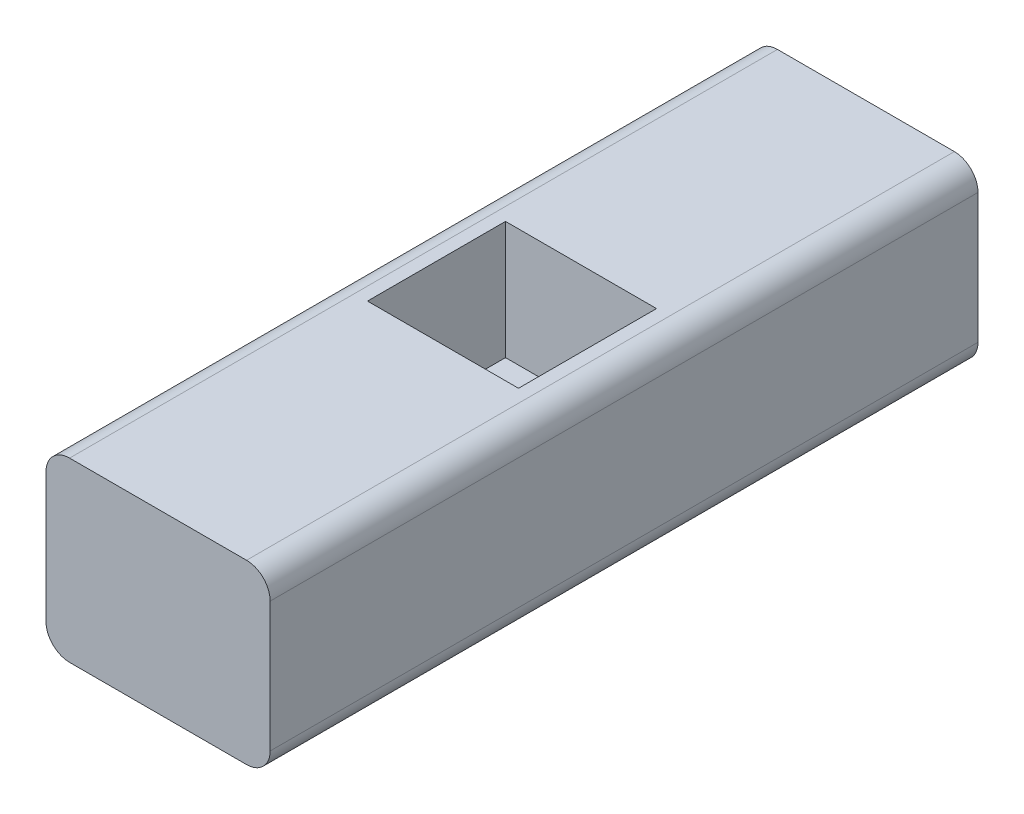
ISO-10303-21;
HEADER;
FILE_DESCRIPTION(('STEP AP214'),'2;1');
FILE_NAME('part.step','',(''),(''),'','','');
FILE_SCHEMA(('AUTOMOTIVE_DESIGN { 1 0 10303 214 1 1 1 1 }'));
ENDSEC;
DATA;
#1=APPLICATION_CONTEXT('core data for automotive mechanical design processes');
#2=APPLICATION_PROTOCOL_DEFINITION('international standard','automotive_design',2000,#1);
#3=PRODUCT_CONTEXT('',#1,'mechanical');
#4=PRODUCT('Part','Part','',(#3));
#5=PRODUCT_RELATED_PRODUCT_CATEGORY('part','',(#4));
#6=PRODUCT_DEFINITION_FORMATION('','',#4);
#7=PRODUCT_DEFINITION_CONTEXT('part definition',#1,'design');
#8=PRODUCT_DEFINITION('design','',#6,#7);
#9=PRODUCT_DEFINITION_SHAPE('','',#8);
#10=(LENGTH_UNIT() NAMED_UNIT(*) SI_UNIT(.MILLI.,.METRE.));
#11=(NAMED_UNIT(*) PLANE_ANGLE_UNIT() SI_UNIT($,.RADIAN.));
#12=(NAMED_UNIT(*) SI_UNIT($,.STERADIAN.) SOLID_ANGLE_UNIT());
#13=UNCERTAINTY_MEASURE_WITH_UNIT(LENGTH_MEASURE(1.E-05),#10,'distance_accuracy_value','');
#14=(GEOMETRIC_REPRESENTATION_CONTEXT(3) GLOBAL_UNCERTAINTY_ASSIGNED_CONTEXT((#13)) GLOBAL_UNIT_ASSIGNED_CONTEXT((#10,
#11,#12)) REPRESENTATION_CONTEXT('',''));
#15=CARTESIAN_POINT('',(0.,0.,0.));
#16=DIRECTION('',(0.,0.,1.));
#17=DIRECTION('',(1.,0.,0.));
#18=AXIS2_PLACEMENT_3D('',#15,#16,#17);
#19=CARTESIAN_POINT('',(15.,-11.,120.));
#20=DIRECTION('',(0.,0.,-1.));
#21=DIRECTION('',(-1.,0.,0.));
#22=AXIS2_PLACEMENT_3D('',#19,#20,#21);
#23=CYLINDRICAL_SURFACE('',#22,4.);
#24=CARTESIAN_POINT('',(15.,-11.,0.));
#25=DIRECTION('',(0.,0.,1.));
#26=DIRECTION('',(1.,0.,0.));
#27=AXIS2_PLACEMENT_3D('',#24,#25,#26);
#28=CIRCLE('',#27,4.);
#29=CARTESIAN_POINT('',(15.,-15.,0.));
#30=VERTEX_POINT('',#29);
#31=CARTESIAN_POINT('',(19.,-11.,0.));
#32=VERTEX_POINT('',#31);
#33=EDGE_CURVE('E147',#30,#32,#28,.T.);
#34=ORIENTED_EDGE('',*,*,#33,.T.);
#35=DIRECTION('',(0.,0.,-1.));
#36=VECTOR('',#35,1.);
#37=CARTESIAN_POINT('',(19.,-11.,120.));
#38=LINE('',#37,#36);
#39=CARTESIAN_POINT('',(19.,-11.,120.));
#40=VERTEX_POINT('',#39);
#41=EDGE_CURVE('E176',#40,#32,#38,.T.);
#42=ORIENTED_EDGE('',*,*,#41,.F.);
#43=CARTESIAN_POINT('',(15.,-11.,120.));
#44=DIRECTION('',(0.,0.,1.));
#45=DIRECTION('',(1.,0.,0.));
#46=AXIS2_PLACEMENT_3D('',#43,#44,#45);
#47=CIRCLE('',#46,4.);
#48=CARTESIAN_POINT('',(15.,-15.,120.));
#49=VERTEX_POINT('',#48);
#50=EDGE_CURVE('E163',#49,#40,#47,.T.);
#51=ORIENTED_EDGE('',*,*,#50,.F.);
#52=DIRECTION('',(0.,0.,-1.));
#53=VECTOR('',#52,1.);
#54=CARTESIAN_POINT('',(15.,-15.,120.));
#55=LINE('',#54,#53);
#56=EDGE_CURVE('E143',#49,#30,#55,.T.);
#57=ORIENTED_EDGE('',*,*,#56,.T.);
#58=EDGE_LOOP('',(#34,#42,#51,#57));
#59=FACE_BOUND('',#58,.T.);
#60=ADVANCED_FACE('F39',(#59),#23,.T.);
#61=CARTESIAN_POINT('',(19.,-11.,120.));
#62=DIRECTION('',(-1.,0.,0.));
#63=DIRECTION('',(0.,0.,1.));
#64=AXIS2_PLACEMENT_3D('',#61,#62,#63);
#65=PLANE('',#64);
#66=DIRECTION('',(0.,1.,0.));
#67=VECTOR('',#66,1.);
#68=CARTESIAN_POINT('',(19.,-11.,0.));
#69=LINE('',#68,#67);
#70=CARTESIAN_POINT('',(19.,11.,0.));
#71=VERTEX_POINT('',#70);
#72=EDGE_CURVE('E150',#32,#71,#69,.T.);
#73=ORIENTED_EDGE('',*,*,#72,.T.);
#74=DIRECTION('',(0.,0.,-1.));
#75=VECTOR('',#74,1.);
#76=CARTESIAN_POINT('',(19.,11.,120.));
#77=LINE('',#76,#75);
#78=CARTESIAN_POINT('',(19.,11.,120.));
#79=VERTEX_POINT('',#78);
#80=EDGE_CURVE('E173',#79,#71,#77,.T.);
#81=ORIENTED_EDGE('',*,*,#80,.F.);
#82=DIRECTION('',(0.,1.,0.));
#83=VECTOR('',#82,1.);
#84=CARTESIAN_POINT('',(19.,-11.,120.));
#85=LINE('',#84,#83);
#86=EDGE_CURVE('E104',#40,#79,#85,.T.);
#87=ORIENTED_EDGE('',*,*,#86,.F.);
#88=ORIENTED_EDGE('',*,*,#41,.T.);
#89=EDGE_LOOP('',(#73,#81,#87,#88));
#90=FACE_BOUND('',#89,.T.);
#91=ADVANCED_FACE('F243',(#90),#65,.F.);
#92=CARTESIAN_POINT('',(15.,11.,120.));
#93=DIRECTION('',(0.,0.,-1.));
#94=DIRECTION('',(-1.,0.,0.));
#95=AXIS2_PLACEMENT_3D('',#92,#93,#94);
#96=CYLINDRICAL_SURFACE('',#95,4.);
#97=CARTESIAN_POINT('',(15.,11.,0.));
#98=DIRECTION('',(0.,0.,1.));
#99=DIRECTION('',(-1.,0.,0.));
#100=AXIS2_PLACEMENT_3D('',#97,#98,#99);
#101=CIRCLE('',#100,4.);
#102=CARTESIAN_POINT('',(15.,15.,0.));
#103=VERTEX_POINT('',#102);
#104=EDGE_CURVE('E153',#71,#103,#101,.T.);
#105=ORIENTED_EDGE('',*,*,#104,.T.);
#106=DIRECTION('',(0.,0.,-1.));
#107=VECTOR('',#106,1.);
#108=CARTESIAN_POINT('',(15.,15.,120.));
#109=LINE('',#108,#107);
#110=CARTESIAN_POINT('',(15.,15.,120.));
#111=VERTEX_POINT('',#110);
#112=EDGE_CURVE('E170',#111,#103,#109,.T.);
#113=ORIENTED_EDGE('',*,*,#112,.F.);
#114=CARTESIAN_POINT('',(15.,11.,120.));
#115=DIRECTION('',(0.,0.,1.));
#116=DIRECTION('',(-1.,0.,0.));
#117=AXIS2_PLACEMENT_3D('',#114,#115,#116);
#118=CIRCLE('',#117,4.);
#119=EDGE_CURVE('E225',#79,#111,#118,.T.);
#120=ORIENTED_EDGE('',*,*,#119,.F.);
#121=ORIENTED_EDGE('',*,*,#80,.T.);
#122=EDGE_LOOP('',(#105,#113,#120,#121));
#123=FACE_BOUND('',#122,.T.);
#124=ADVANCED_FACE('F246',(#123),#96,.T.);
#125=CARTESIAN_POINT('',(-15.,15.,120.));
#126=DIRECTION('',(0.,-1.,0.));
#127=DIRECTION('',(0.,0.,-1.));
#128=AXIS2_PLACEMENT_3D('',#125,#126,#127);
#129=PLANE('',#128);
#130=DIRECTION('',(-1.,0.,0.));
#131=VECTOR('',#130,1.);
#132=CARTESIAN_POINT('',(-15.,15.,48.3));
#133=LINE('',#132,#131);
#134=CARTESIAN_POINT('',(12.8,15.,48.3));
#135=VERTEX_POINT('',#134);
#136=CARTESIAN_POINT('',(-12.8,15.,48.3));
#137=VERTEX_POINT('',#136);
#138=EDGE_CURVE('E180',#135,#137,#133,.T.);
#139=ORIENTED_EDGE('',*,*,#138,.F.);
#140=DIRECTION('',(0.,0.,1.));
#141=VECTOR('',#140,1.);
#142=CARTESIAN_POINT('',(12.8,15.,120.));
#143=LINE('',#142,#141);
#144=CARTESIAN_POINT('',(12.8,15.,71.7));
#145=VERTEX_POINT('',#144);
#146=EDGE_CURVE('E11',#135,#145,#143,.T.);
#147=ORIENTED_EDGE('',*,*,#146,.T.);
#148=DIRECTION('',(1.,0.,0.));
#149=VECTOR('',#148,1.);
#150=CARTESIAN_POINT('',(-15.,15.,71.7));
#151=LINE('',#150,#149);
#152=CARTESIAN_POINT('',(-12.8,15.,71.7));
#153=VERTEX_POINT('',#152);
#154=EDGE_CURVE('E46',#153,#145,#151,.T.);
#155=ORIENTED_EDGE('',*,*,#154,.F.);
#156=DIRECTION('',(0.,0.,1.));
#157=VECTOR('',#156,1.);
#158=CARTESIAN_POINT('',(-12.8,15.,120.));
#159=LINE('',#158,#157);
#160=EDGE_CURVE('E178',#137,#153,#159,.T.);
#161=ORIENTED_EDGE('',*,*,#160,.F.);
#162=EDGE_LOOP('',(#139,#147,#155,#161));
#163=FACE_BOUND('',#162,.T.);
#164=DIRECTION('',(-1.,0.,0.));
#165=VECTOR('',#164,1.);
#166=CARTESIAN_POINT('',(-15.,15.,0.));
#167=LINE('',#166,#165);
#168=CARTESIAN_POINT('',(-15.,15.,0.));
#169=VERTEX_POINT('',#168);
#170=EDGE_CURVE('E155',#103,#169,#167,.T.);
#171=ORIENTED_EDGE('',*,*,#170,.T.);
#172=DIRECTION('',(0.,0.,-1.));
#173=VECTOR('',#172,1.);
#174=CARTESIAN_POINT('',(-15.,15.,120.));
#175=LINE('',#174,#173);
#176=CARTESIAN_POINT('',(-15.,15.,120.));
#177=VERTEX_POINT('',#176);
#178=EDGE_CURVE('E167',#177,#169,#175,.T.);
#179=ORIENTED_EDGE('',*,*,#178,.F.);
#180=DIRECTION('',(-1.,0.,0.));
#181=VECTOR('',#180,1.);
#182=CARTESIAN_POINT('',(-15.,15.,120.));
#183=LINE('',#182,#181);
#184=EDGE_CURVE('E227',#111,#177,#183,.T.);
#185=ORIENTED_EDGE('',*,*,#184,.F.);
#186=ORIENTED_EDGE('',*,*,#112,.T.);
#187=EDGE_LOOP('',(#171,#179,#185,#186));
#188=FACE_BOUND('',#187,.T.);
#189=ADVANCED_FACE('F208',(#163,#188),#129,.F.);
#190=CARTESIAN_POINT('',(-15.,11.,120.));
#191=DIRECTION('',(0.,0.,-1.));
#192=DIRECTION('',(-1.,0.,0.));
#193=AXIS2_PLACEMENT_3D('',#190,#191,#192);
#194=CYLINDRICAL_SURFACE('',#193,4.);
#195=CARTESIAN_POINT('',(-15.,11.,0.));
#196=DIRECTION('',(0.,0.,1.));
#197=DIRECTION('',(-1.,0.,0.));
#198=AXIS2_PLACEMENT_3D('',#195,#196,#197);
#199=CIRCLE('',#198,4.);
#200=CARTESIAN_POINT('',(-19.,11.,0.));
#201=VERTEX_POINT('',#200);
#202=EDGE_CURVE('E157',#169,#201,#199,.T.);
#203=ORIENTED_EDGE('',*,*,#202,.T.);
#204=DIRECTION('',(0.,0.,-1.));
#205=VECTOR('',#204,1.);
#206=CARTESIAN_POINT('',(-19.,11.,120.));
#207=LINE('',#206,#205);
#208=CARTESIAN_POINT('',(-19.,11.,120.));
#209=VERTEX_POINT('',#208);
#210=EDGE_CURVE('E138',#209,#201,#207,.T.);
#211=ORIENTED_EDGE('',*,*,#210,.F.);
#212=CARTESIAN_POINT('',(-15.,11.,120.));
#213=DIRECTION('',(0.,0.,1.));
#214=DIRECTION('',(-1.,0.,0.));
#215=AXIS2_PLACEMENT_3D('',#212,#213,#214);
#216=CIRCLE('',#215,4.);
#217=EDGE_CURVE('E126',#177,#209,#216,.T.);
#218=ORIENTED_EDGE('',*,*,#217,.F.);
#219=ORIENTED_EDGE('',*,*,#178,.T.);
#220=EDGE_LOOP('',(#203,#211,#218,#219));
#221=FACE_BOUND('',#220,.T.);
#222=ADVANCED_FACE('F235',(#221),#194,.T.);
#223=CARTESIAN_POINT('',(-19.,-11.,120.));
#224=DIRECTION('',(1.,0.,0.));
#225=DIRECTION('',(0.,0.,-1.));
#226=AXIS2_PLACEMENT_3D('',#223,#224,#225);
#227=PLANE('',#226);
#228=DIRECTION('',(0.,-1.,0.));
#229=VECTOR('',#228,1.);
#230=CARTESIAN_POINT('',(-19.,-11.,0.));
#231=LINE('',#230,#229);
#232=CARTESIAN_POINT('',(-19.,-11.,0.));
#233=VERTEX_POINT('',#232);
#234=EDGE_CURVE('E135',#201,#233,#231,.T.);
#235=ORIENTED_EDGE('',*,*,#234,.T.);
#236=DIRECTION('',(0.,0.,-1.));
#237=VECTOR('',#236,1.);
#238=CARTESIAN_POINT('',(-19.,-11.,120.));
#239=LINE('',#238,#237);
#240=CARTESIAN_POINT('',(-19.,-11.,120.));
#241=VERTEX_POINT('',#240);
#242=EDGE_CURVE('E132',#241,#233,#239,.T.);
#243=ORIENTED_EDGE('',*,*,#242,.F.);
#244=DIRECTION('',(0.,-1.,0.));
#245=VECTOR('',#244,1.);
#246=CARTESIAN_POINT('',(-19.,-11.,120.));
#247=LINE('',#246,#245);
#248=EDGE_CURVE('E119',#209,#241,#247,.T.);
#249=ORIENTED_EDGE('',*,*,#248,.F.);
#250=ORIENTED_EDGE('',*,*,#210,.T.);
#251=EDGE_LOOP('',(#235,#243,#249,#250));
#252=FACE_BOUND('',#251,.T.);
#253=ADVANCED_FACE('F133',(#252),#227,.F.);
#254=CARTESIAN_POINT('',(-15.,-11.,120.));
#255=DIRECTION('',(0.,0.,-1.));
#256=DIRECTION('',(-1.,0.,0.));
#257=AXIS2_PLACEMENT_3D('',#254,#255,#256);
#258=CYLINDRICAL_SURFACE('',#257,4.);
#259=CARTESIAN_POINT('',(-15.,-11.,0.));
#260=DIRECTION('',(0.,0.,1.));
#261=DIRECTION('',(-1.,0.,0.));
#262=AXIS2_PLACEMENT_3D('',#259,#260,#261);
#263=CIRCLE('',#262,4.);
#264=CARTESIAN_POINT('',(-15.,-15.,0.));
#265=VERTEX_POINT('',#264);
#266=EDGE_CURVE('E160',#233,#265,#263,.T.);
#267=ORIENTED_EDGE('',*,*,#266,.T.);
#268=DIRECTION('',(0.,0.,-1.));
#269=VECTOR('',#268,1.);
#270=CARTESIAN_POINT('',(-15.,-15.,120.));
#271=LINE('',#270,#269);
#272=CARTESIAN_POINT('',(-15.,-15.,120.));
#273=VERTEX_POINT('',#272);
#274=EDGE_CURVE('E139',#273,#265,#271,.T.);
#275=ORIENTED_EDGE('',*,*,#274,.F.);
#276=CARTESIAN_POINT('',(-15.,-11.,120.));
#277=DIRECTION('',(0.,0.,1.));
#278=DIRECTION('',(-1.,0.,0.));
#279=AXIS2_PLACEMENT_3D('',#276,#277,#278);
#280=CIRCLE('',#279,4.);
#281=EDGE_CURVE('E123',#241,#273,#280,.T.);
#282=ORIENTED_EDGE('',*,*,#281,.F.);
#283=ORIENTED_EDGE('',*,*,#242,.T.);
#284=EDGE_LOOP('',(#267,#275,#282,#283));
#285=FACE_BOUND('',#284,.T.);
#286=ADVANCED_FACE('F141',(#285),#258,.T.);
#287=CARTESIAN_POINT('',(-15.,-15.,120.));
#288=DIRECTION('',(0.,1.,0.));
#289=DIRECTION('',(0.,0.,1.));
#290=AXIS2_PLACEMENT_3D('',#287,#288,#289);
#291=PLANE('',#290);
#292=DIRECTION('',(1.,0.,0.));
#293=VECTOR('',#292,1.);
#294=CARTESIAN_POINT('',(-15.,-15.,0.));
#295=LINE('',#294,#293);
#296=EDGE_CURVE('E95',#265,#30,#295,.T.);
#297=ORIENTED_EDGE('',*,*,#296,.T.);
#298=ORIENTED_EDGE('',*,*,#56,.F.);
#299=DIRECTION('',(1.,0.,0.));
#300=VECTOR('',#299,1.);
#301=CARTESIAN_POINT('',(-15.,-15.,120.));
#302=LINE('',#301,#300);
#303=EDGE_CURVE('E62',#273,#49,#302,.T.);
#304=ORIENTED_EDGE('',*,*,#303,.F.);
#305=ORIENTED_EDGE('',*,*,#274,.T.);
#306=EDGE_LOOP('',(#297,#298,#304,#305));
#307=FACE_BOUND('',#306,.T.);
#308=ADVANCED_FACE('F239',(#307),#291,.F.);
#309=CARTESIAN_POINT('',(15.,-11.,120.));
#310=DIRECTION('',(0.,0.,1.));
#311=DIRECTION('',(1.,0.,0.));
#312=AXIS2_PLACEMENT_3D('',#309,#310,#311);
#313=PLANE('',#312);
#314=ORIENTED_EDGE('',*,*,#50,.T.);
#315=ORIENTED_EDGE('',*,*,#86,.T.);
#316=ORIENTED_EDGE('',*,*,#119,.T.);
#317=ORIENTED_EDGE('',*,*,#184,.T.);
#318=ORIENTED_EDGE('',*,*,#217,.T.);
#319=ORIENTED_EDGE('',*,*,#248,.T.);
#320=ORIENTED_EDGE('',*,*,#281,.T.);
#321=ORIENTED_EDGE('',*,*,#303,.T.);
#322=EDGE_LOOP('',(#314,#315,#316,#317,#318,#319,#320,#321));
#323=FACE_BOUND('',#322,.T.);
#324=ADVANCED_FACE('F121',(#323),#313,.T.);
#325=CARTESIAN_POINT('',(15.,-11.,0.));
#326=DIRECTION('',(0.,0.,1.));
#327=DIRECTION('',(1.,0.,0.));
#328=AXIS2_PLACEMENT_3D('',#325,#326,#327);
#329=PLANE('',#328);
#330=ORIENTED_EDGE('',*,*,#33,.F.);
#331=ORIENTED_EDGE('',*,*,#296,.F.);
#332=ORIENTED_EDGE('',*,*,#266,.F.);
#333=ORIENTED_EDGE('',*,*,#234,.F.);
#334=ORIENTED_EDGE('',*,*,#202,.F.);
#335=ORIENTED_EDGE('',*,*,#170,.F.);
#336=ORIENTED_EDGE('',*,*,#104,.F.);
#337=ORIENTED_EDGE('',*,*,#72,.F.);
#338=EDGE_LOOP('',(#330,#331,#332,#333,#334,#335,#336,#337));
#339=FACE_BOUND('',#338,.T.);
#340=ADVANCED_FACE('F238',(#339),#329,.F.);
#341=CARTESIAN_POINT('',(12.8,-5.,71.7));
#342=DIRECTION('',(0.,0.,-1.));
#343=DIRECTION('',(-1.,0.,0.));
#344=AXIS2_PLACEMENT_3D('',#341,#342,#343);
#345=PLANE('',#344);
#346=ORIENTED_EDGE('',*,*,#154,.T.);
#347=DIRECTION('',(0.,-1.,0.));
#348=VECTOR('',#347,1.);
#349=CARTESIAN_POINT('',(12.8,-5.,71.7));
#350=LINE('',#349,#348);
#351=CARTESIAN_POINT('',(12.8,-5.,71.7));
#352=VERTEX_POINT('',#351);
#353=EDGE_CURVE('E191',#145,#352,#350,.T.);
#354=ORIENTED_EDGE('',*,*,#353,.T.);
#355=DIRECTION('',(-1.,0.,0.));
#356=VECTOR('',#355,1.);
#357=CARTESIAN_POINT('',(12.8,-5.,71.7));
#358=LINE('',#357,#356);
#359=CARTESIAN_POINT('',(-12.8,-5.,71.7));
#360=VERTEX_POINT('',#359);
#361=EDGE_CURVE('E151',#352,#360,#358,.T.);
#362=ORIENTED_EDGE('',*,*,#361,.T.);
#363=DIRECTION('',(0.,-1.,0.));
#364=VECTOR('',#363,1.);
#365=CARTESIAN_POINT('',(-12.8,-5.,71.7));
#366=LINE('',#365,#364);
#367=EDGE_CURVE('E195',#153,#360,#366,.T.);
#368=ORIENTED_EDGE('',*,*,#367,.F.);
#369=EDGE_LOOP('',(#346,#354,#362,#368));
#370=FACE_BOUND('',#369,.T.);
#371=ADVANCED_FACE('F188',(#370),#345,.T.);
#372=CARTESIAN_POINT('',(12.8,-5.,48.3));
#373=DIRECTION('',(0.,0.,1.));
#374=DIRECTION('',(1.,0.,0.));
#375=AXIS2_PLACEMENT_3D('',#372,#373,#374);
#376=PLANE('',#375);
#377=ORIENTED_EDGE('',*,*,#138,.T.);
#378=DIRECTION('',(0.,1.,0.));
#379=VECTOR('',#378,1.);
#380=CARTESIAN_POINT('',(-12.8,-5.,48.3));
#381=LINE('',#380,#379);
#382=CARTESIAN_POINT('',(-12.8,-5.,48.3));
#383=VERTEX_POINT('',#382);
#384=EDGE_CURVE('E53',#383,#137,#381,.T.);
#385=ORIENTED_EDGE('',*,*,#384,.F.);
#386=DIRECTION('',(-1.,0.,0.));
#387=VECTOR('',#386,1.);
#388=CARTESIAN_POINT('',(12.8,-5.,48.3));
#389=LINE('',#388,#387);
#390=CARTESIAN_POINT('',(12.8,-5.,48.3));
#391=VERTEX_POINT('',#390);
#392=EDGE_CURVE('E217',#391,#383,#389,.T.);
#393=ORIENTED_EDGE('',*,*,#392,.F.);
#394=DIRECTION('',(0.,1.,0.));
#395=VECTOR('',#394,1.);
#396=CARTESIAN_POINT('',(12.8,-5.,48.3));
#397=LINE('',#396,#395);
#398=EDGE_CURVE('E214',#391,#135,#397,.T.);
#399=ORIENTED_EDGE('',*,*,#398,.T.);
#400=EDGE_LOOP('',(#377,#385,#393,#399));
#401=FACE_BOUND('',#400,.T.);
#402=ADVANCED_FACE('F211',(#401),#376,.T.);
#403=CARTESIAN_POINT('',(12.8,0.,0.));
#404=DIRECTION('',(1.,0.,0.));
#405=DIRECTION('',(0.,0.,-1.));
#406=AXIS2_PLACEMENT_3D('',#403,#404,#405);
#407=PLANE('',#406);
#408=ORIENTED_EDGE('',*,*,#398,.F.);
#409=DIRECTION('',(0.,0.,-1.));
#410=VECTOR('',#409,1.);
#411=CARTESIAN_POINT('',(12.8,-5.,48.3));
#412=LINE('',#411,#410);
#413=EDGE_CURVE('E204',#352,#391,#412,.T.);
#414=ORIENTED_EDGE('',*,*,#413,.F.);
#415=ORIENTED_EDGE('',*,*,#353,.F.);
#416=ORIENTED_EDGE('',*,*,#146,.F.);
#417=EDGE_LOOP('',(#408,#414,#415,#416));
#418=FACE_BOUND('',#417,.T.);
#419=ADVANCED_FACE('F201',(#418),#407,.F.);
#420=CARTESIAN_POINT('',(-12.8,0.,0.));
#421=DIRECTION('',(1.,0.,0.));
#422=DIRECTION('',(0.,0.,-1.));
#423=AXIS2_PLACEMENT_3D('',#420,#421,#422);
#424=PLANE('',#423);
#425=ORIENTED_EDGE('',*,*,#160,.T.);
#426=ORIENTED_EDGE('',*,*,#367,.T.);
#427=DIRECTION('',(0.,0.,-1.));
#428=VECTOR('',#427,1.);
#429=CARTESIAN_POINT('',(-12.8,-5.,48.3));
#430=LINE('',#429,#428);
#431=EDGE_CURVE('E369',#360,#383,#430,.T.);
#432=ORIENTED_EDGE('',*,*,#431,.T.);
#433=ORIENTED_EDGE('',*,*,#384,.T.);
#434=EDGE_LOOP('',(#425,#426,#432,#433));
#435=FACE_BOUND('',#434,.T.);
#436=ADVANCED_FACE('F346',(#435),#424,.T.);
#437=CARTESIAN_POINT('',(12.8,-5.,48.3));
#438=DIRECTION('',(0.,1.,0.));
#439=DIRECTION('',(0.,0.,1.));
#440=AXIS2_PLACEMENT_3D('',#437,#438,#439);
#441=PLANE('',#440);
#442=ORIENTED_EDGE('',*,*,#361,.F.);
#443=ORIENTED_EDGE('',*,*,#413,.T.);
#444=ORIENTED_EDGE('',*,*,#392,.T.);
#445=ORIENTED_EDGE('',*,*,#431,.F.);
#446=EDGE_LOOP('',(#442,#443,#444,#445));
#447=FACE_BOUND('',#446,.T.);
#448=ADVANCED_FACE('F355',(#447),#441,.T.);
#449=CLOSED_SHELL('',(#60,#91,#124,#189,#222,#253,#286,#308,#324,#340,#371,#402,#419,#436,#448));
#450=MANIFOLD_SOLID_BREP('B2',#449);
#451=ADVANCED_BREP_SHAPE_REPRESENTATION('',(#18,#450),#14);
#452=SHAPE_DEFINITION_REPRESENTATION(#9,#451);
ENDSEC;
END-ISO-10303-21;
